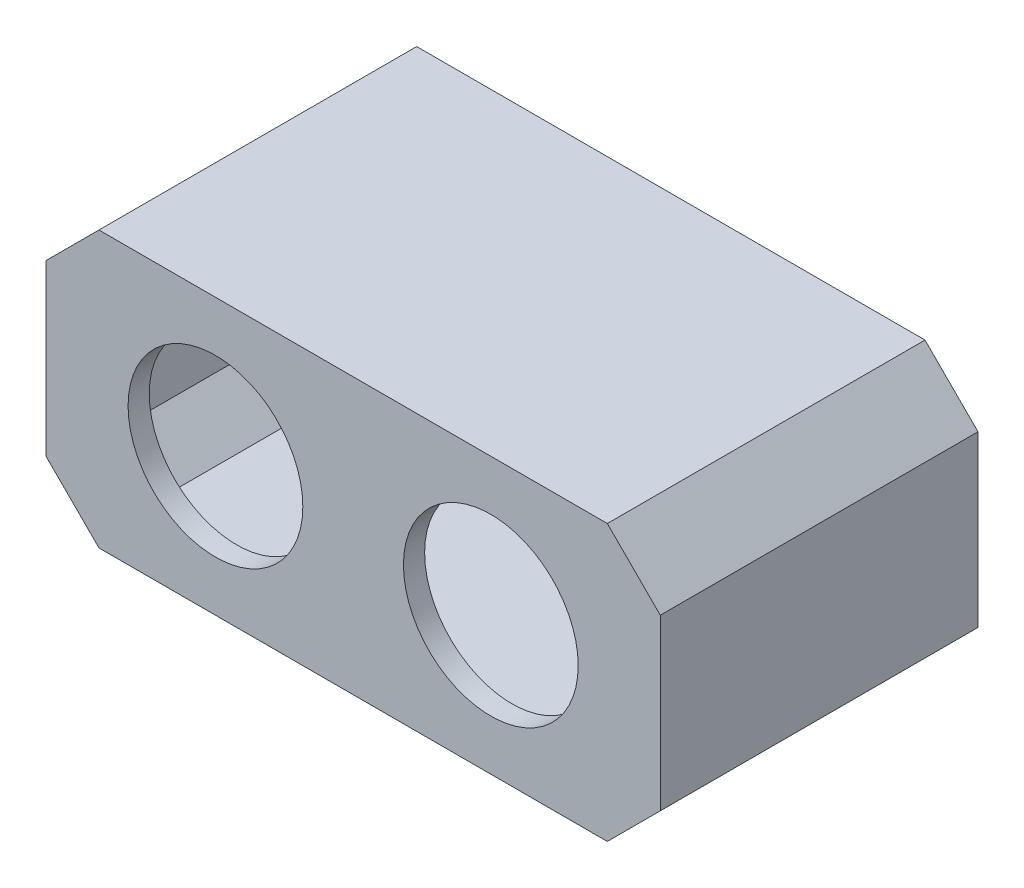
ISO-10303-21;
HEADER;
FILE_DESCRIPTION(('STEP AP214'),'2;1');
FILE_NAME('part.step','',(''),(''),'','','');
FILE_SCHEMA(('AUTOMOTIVE_DESIGN { 1 0 10303 214 1 1 1 1 }'));
ENDSEC;
DATA;
#1=APPLICATION_CONTEXT('core data for automotive mechanical design processes');
#2=APPLICATION_PROTOCOL_DEFINITION('international standard','automotive_design',2000,#1);
#3=PRODUCT_CONTEXT('',#1,'mechanical');
#4=PRODUCT('Part','Part','',(#3));
#5=PRODUCT_RELATED_PRODUCT_CATEGORY('part','',(#4));
#6=PRODUCT_DEFINITION_FORMATION('','',#4);
#7=PRODUCT_DEFINITION_CONTEXT('part definition',#1,'design');
#8=PRODUCT_DEFINITION('design','',#6,#7);
#9=PRODUCT_DEFINITION_SHAPE('','',#8);
#10=(LENGTH_UNIT() NAMED_UNIT(*) SI_UNIT(.MILLI.,.METRE.));
#11=(NAMED_UNIT(*) PLANE_ANGLE_UNIT() SI_UNIT($,.RADIAN.));
#12=(NAMED_UNIT(*) SI_UNIT($,.STERADIAN.) SOLID_ANGLE_UNIT());
#13=UNCERTAINTY_MEASURE_WITH_UNIT(LENGTH_MEASURE(1.E-05),#10,'distance_accuracy_value','');
#14=(GEOMETRIC_REPRESENTATION_CONTEXT(3) GLOBAL_UNCERTAINTY_ASSIGNED_CONTEXT((#13)) GLOBAL_UNIT_ASSIGNED_CONTEXT((#10,
#11,#12)) REPRESENTATION_CONTEXT('',''));
#15=CARTESIAN_POINT('',(0.,0.,0.));
#16=DIRECTION('',(0.,0.,1.));
#17=DIRECTION('',(1.,0.,0.));
#18=AXIS2_PLACEMENT_3D('',#15,#16,#17);
#19=CARTESIAN_POINT('',(0.,0.,-30.));
#20=DIRECTION('',(0.,0.,-1.));
#21=DIRECTION('',(-1.,0.,0.));
#22=AXIS2_PLACEMENT_3D('',#19,#20,#21);
#23=PLANE('',#22);
#24=DIRECTION('',(0.,1.,0.));
#25=VECTOR('',#24,1.);
#26=CARTESIAN_POINT('',(29.,-13.,-30.));
#27=LINE('',#26,#25);
#28=CARTESIAN_POINT('',(29.,-7.99999999999998,-30.));
#29=VERTEX_POINT('',#28);
#30=CARTESIAN_POINT('',(29.,7.99999999999999,-30.));
#31=VERTEX_POINT('',#30);
#32=EDGE_CURVE('E232',#29,#31,#27,.T.);
#33=ORIENTED_EDGE('',*,*,#32,.F.);
#34=DIRECTION('',(0.707106781186546,0.707106781186549,0.));
#35=VECTOR('',#34,1.);
#36=CARTESIAN_POINT('',(18.5000000000001,-18.5,-30.));
#37=LINE('',#36,#35);
#38=CARTESIAN_POINT('',(24.,-13.,-30.));
#39=VERTEX_POINT('',#38);
#40=EDGE_CURVE('E276',#29,#39,#37,.F.);
#41=ORIENTED_EDGE('',*,*,#40,.T.);
#42=DIRECTION('',(1.,0.,0.));
#43=VECTOR('',#42,1.);
#44=CARTESIAN_POINT('',(-29.,-13.,-30.));
#45=LINE('',#44,#43);
#46=CARTESIAN_POINT('',(-24.,-13.,-30.));
#47=VERTEX_POINT('',#46);
#48=EDGE_CURVE('E245',#47,#39,#45,.T.);
#49=ORIENTED_EDGE('',*,*,#48,.F.);
#50=DIRECTION('',(0.707106781186549,-0.707106781186546,0.));
#51=VECTOR('',#50,1.);
#52=CARTESIAN_POINT('',(-18.4999999999999,-18.5,-30.));
#53=LINE('',#52,#51);
#54=CARTESIAN_POINT('',(-29.,-8.,-30.));
#55=VERTEX_POINT('',#54);
#56=EDGE_CURVE('E280',#47,#55,#53,.F.);
#57=ORIENTED_EDGE('',*,*,#56,.T.);
#58=DIRECTION('',(0.,-1.,0.));
#59=VECTOR('',#58,1.);
#60=CARTESIAN_POINT('',(-29.,-13.,-30.));
#61=LINE('',#60,#59);
#62=CARTESIAN_POINT('',(-29.,7.99999999999997,-30.));
#63=VERTEX_POINT('',#62);
#64=EDGE_CURVE('E238',#63,#55,#61,.T.);
#65=ORIENTED_EDGE('',*,*,#64,.F.);
#66=DIRECTION('',(-0.707106781186546,-0.707106781186549,0.));
#67=VECTOR('',#66,1.);
#68=CARTESIAN_POINT('',(-18.5000000000001,18.5,-30.));
#69=LINE('',#68,#67);
#70=CARTESIAN_POINT('',(-24.,13.,-30.));
#71=VERTEX_POINT('',#70);
#72=EDGE_CURVE('E70',#63,#71,#69,.F.);
#73=ORIENTED_EDGE('',*,*,#72,.T.);
#74=DIRECTION('',(-1.,0.,0.));
#75=VECTOR('',#74,1.);
#76=CARTESIAN_POINT('',(-29.,13.,-30.));
#77=LINE('',#76,#75);
#78=CARTESIAN_POINT('',(24.,13.,-30.));
#79=VERTEX_POINT('',#78);
#80=EDGE_CURVE('E240',#79,#71,#77,.T.);
#81=ORIENTED_EDGE('',*,*,#80,.F.);
#82=DIRECTION('',(-0.707106781186549,0.707106781186546,0.));
#83=VECTOR('',#82,1.);
#84=CARTESIAN_POINT('',(18.4999999999999,18.5,-30.));
#85=LINE('',#84,#83);
#86=EDGE_CURVE('E273',#79,#31,#85,.F.);
#87=ORIENTED_EDGE('',*,*,#86,.T.);
#88=EDGE_LOOP('',(#33,#41,#49,#57,#65,#73,#81,#87));
#89=FACE_BOUND('',#88,.T.);
#90=DIRECTION('',(0.707106781186546,0.707106781186549,0.));
#91=VECTOR('',#90,1.);
#92=CARTESIAN_POINT('',(17.085786437627,-17.0857864376269,-30.));
#93=LINE('',#92,#91);
#94=CARTESIAN_POINT('',(27.,-7.17157287525379,-30.));
#95=VERTEX_POINT('',#94);
#96=CARTESIAN_POINT('',(23.1715728752538,-11.,-30.));
#97=VERTEX_POINT('',#96);
#98=EDGE_CURVE('E220',#95,#97,#93,.F.);
#99=ORIENTED_EDGE('',*,*,#98,.F.);
#100=DIRECTION('',(0.,1.,0.));
#101=VECTOR('',#100,1.);
#102=CARTESIAN_POINT('',(27.,-13.,-30.));
#103=LINE('',#102,#101);
#104=CARTESIAN_POINT('',(27.,7.1715728752538,-30.));
#105=VERTEX_POINT('',#104);
#106=EDGE_CURVE('E189',#95,#105,#103,.T.);
#107=ORIENTED_EDGE('',*,*,#106,.T.);
#108=DIRECTION('',(-0.707106781186549,0.707106781186546,0.));
#109=VECTOR('',#108,1.);
#110=CARTESIAN_POINT('',(17.0857864376268,17.0857864376269,-30.));
#111=LINE('',#110,#109);
#112=CARTESIAN_POINT('',(23.1715728752538,11.,-30.));
#113=VERTEX_POINT('',#112);
#114=EDGE_CURVE('E186',#113,#105,#111,.F.);
#115=ORIENTED_EDGE('',*,*,#114,.F.);
#116=DIRECTION('',(-1.,0.,0.));
#117=VECTOR('',#116,1.);
#118=CARTESIAN_POINT('',(-29.,11.,-30.));
#119=LINE('',#118,#117);
#120=CARTESIAN_POINT('',(-23.1715728752538,11.,-30.));
#121=VERTEX_POINT('',#120);
#122=EDGE_CURVE('E56',#113,#121,#119,.T.);
#123=ORIENTED_EDGE('',*,*,#122,.T.);
#124=DIRECTION('',(-0.707106781186546,-0.707106781186549,0.));
#125=VECTOR('',#124,1.);
#126=CARTESIAN_POINT('',(-17.085786437627,17.0857864376269,-30.));
#127=LINE('',#126,#125);
#128=CARTESIAN_POINT('',(-27.,7.17157287525379,-30.));
#129=VERTEX_POINT('',#128);
#130=EDGE_CURVE('E193',#129,#121,#127,.F.);
#131=ORIENTED_EDGE('',*,*,#130,.F.);
#132=DIRECTION('',(0.,-1.,0.));
#133=VECTOR('',#132,1.);
#134=CARTESIAN_POINT('',(-27.,-13.,-30.));
#135=LINE('',#134,#133);
#136=CARTESIAN_POINT('',(-27.,-7.1715728752538,-30.));
#137=VERTEX_POINT('',#136);
#138=EDGE_CURVE('E230',#129,#137,#135,.T.);
#139=ORIENTED_EDGE('',*,*,#138,.T.);
#140=DIRECTION('',(0.707106781186549,-0.707106781186546,0.));
#141=VECTOR('',#140,1.);
#142=CARTESIAN_POINT('',(-17.0857864376268,-17.0857864376269,-30.));
#143=LINE('',#142,#141);
#144=CARTESIAN_POINT('',(-23.1715728752538,-11.,-30.));
#145=VERTEX_POINT('',#144);
#146=EDGE_CURVE('E223',#145,#137,#143,.F.);
#147=ORIENTED_EDGE('',*,*,#146,.F.);
#148=DIRECTION('',(1.,0.,0.));
#149=VECTOR('',#148,1.);
#150=CARTESIAN_POINT('',(-29.,-11.,-30.));
#151=LINE('',#150,#149);
#152=EDGE_CURVE('E209',#145,#97,#151,.T.);
#153=ORIENTED_EDGE('',*,*,#152,.T.);
#154=EDGE_LOOP('',(#99,#107,#115,#123,#131,#139,#147,#153));
#155=FACE_BOUND('',#154,.T.);
#156=ADVANCED_FACE('F43',(#89,#155),#23,.T.);
#157=CARTESIAN_POINT('',(29.,-13.,-30.));
#158=DIRECTION('',(1.,0.,0.));
#159=DIRECTION('',(0.,0.,-1.));
#160=AXIS2_PLACEMENT_3D('',#157,#158,#159);
#161=PLANE('',#160);
#162=DIRECTION('',(0.,1.,0.));
#163=VECTOR('',#162,1.);
#164=CARTESIAN_POINT('',(29.,-13.,0.));
#165=LINE('',#164,#163);
#166=CARTESIAN_POINT('',(29.,-7.99999999999998,0.));
#167=VERTEX_POINT('',#166);
#168=CARTESIAN_POINT('',(29.,7.99999999999999,0.));
#169=VERTEX_POINT('',#168);
#170=EDGE_CURVE('E222',#167,#169,#165,.T.);
#171=ORIENTED_EDGE('',*,*,#170,.F.);
#172=DIRECTION('',(0.,0.,-1.));
#173=VECTOR('',#172,1.);
#174=CARTESIAN_POINT('',(29.,-7.99999999999998,-30.));
#175=LINE('',#174,#173);
#176=EDGE_CURVE('E275',#167,#29,#175,.T.);
#177=ORIENTED_EDGE('',*,*,#176,.T.);
#178=ORIENTED_EDGE('',*,*,#32,.T.);
#179=DIRECTION('',(0.,0.,1.));
#180=VECTOR('',#179,1.);
#181=CARTESIAN_POINT('',(29.,7.99999999999999,-30.));
#182=LINE('',#181,#180);
#183=EDGE_CURVE('E267',#31,#169,#182,.T.);
#184=ORIENTED_EDGE('',*,*,#183,.T.);
#185=EDGE_LOOP('',(#171,#177,#178,#184));
#186=FACE_BOUND('',#185,.T.);
#187=ADVANCED_FACE('F299',(#186),#161,.T.);
#188=CARTESIAN_POINT('',(-29.,-13.,-30.));
#189=DIRECTION('',(0.,-1.,0.));
#190=DIRECTION('',(0.,0.,-1.));
#191=AXIS2_PLACEMENT_3D('',#188,#189,#190);
#192=PLANE('',#191);
#193=CARTESIAN_POINT('',(0.,-13.,-15.));
#194=DIRECTION('',(0.,-1.,0.));
#195=DIRECTION('',(0.,0.,-1.));
#196=AXIS2_PLACEMENT_3D('',#193,#194,#195);
#197=CIRCLE('',#196,12.);
#198=CARTESIAN_POINT('',(0.,-13.,-27.));
#199=VERTEX_POINT('',#198);
#200=EDGE_CURVE('E512',#199,#199,#197,.T.);
#201=ORIENTED_EDGE('',*,*,#200,.F.);
#202=EDGE_LOOP('',(#201));
#203=FACE_BOUND('',#202,.T.);
#204=ORIENTED_EDGE('',*,*,#48,.T.);
#205=DIRECTION('',(0.,0.,1.));
#206=VECTOR('',#205,1.);
#207=CARTESIAN_POINT('',(24.,-13.,-30.));
#208=LINE('',#207,#206);
#209=CARTESIAN_POINT('',(24.,-13.,0.));
#210=VERTEX_POINT('',#209);
#211=EDGE_CURVE('E256',#39,#210,#208,.T.);
#212=ORIENTED_EDGE('',*,*,#211,.T.);
#213=DIRECTION('',(1.,0.,0.));
#214=VECTOR('',#213,1.);
#215=CARTESIAN_POINT('',(-29.,-13.,0.));
#216=LINE('',#215,#214);
#217=CARTESIAN_POINT('',(-24.,-13.,0.));
#218=VERTEX_POINT('',#217);
#219=EDGE_CURVE('E236',#218,#210,#216,.T.);
#220=ORIENTED_EDGE('',*,*,#219,.F.);
#221=DIRECTION('',(0.,0.,-1.));
#222=VECTOR('',#221,1.);
#223=CARTESIAN_POINT('',(-24.,-13.,-30.));
#224=LINE('',#223,#222);
#225=EDGE_CURVE('E248',#218,#47,#224,.T.);
#226=ORIENTED_EDGE('',*,*,#225,.T.);
#227=EDGE_LOOP('',(#204,#212,#220,#226));
#228=FACE_BOUND('',#227,.T.);
#229=ADVANCED_FACE('F307',(#203,#228),#192,.T.);
#230=CARTESIAN_POINT('',(-29.,-13.,-30.));
#231=DIRECTION('',(-1.,0.,0.));
#232=DIRECTION('',(0.,0.,1.));
#233=AXIS2_PLACEMENT_3D('',#230,#231,#232);
#234=PLANE('',#233);
#235=ORIENTED_EDGE('',*,*,#64,.T.);
#236=DIRECTION('',(0.,0.,1.));
#237=VECTOR('',#236,1.);
#238=CARTESIAN_POINT('',(-29.,-8.,-30.));
#239=LINE('',#238,#237);
#240=CARTESIAN_POINT('',(-29.,-8.,0.));
#241=VERTEX_POINT('',#240);
#242=EDGE_CURVE('E285',#55,#241,#239,.T.);
#243=ORIENTED_EDGE('',*,*,#242,.T.);
#244=DIRECTION('',(0.,-1.,0.));
#245=VECTOR('',#244,1.);
#246=CARTESIAN_POINT('',(-29.,-13.,0.));
#247=LINE('',#246,#245);
#248=CARTESIAN_POINT('',(-29.,7.99999999999997,0.));
#249=VERTEX_POINT('',#248);
#250=EDGE_CURVE('E252',#249,#241,#247,.T.);
#251=ORIENTED_EDGE('',*,*,#250,.F.);
#252=DIRECTION('',(0.,0.,-1.));
#253=VECTOR('',#252,1.);
#254=CARTESIAN_POINT('',(-29.,7.99999999999997,-30.));
#255=LINE('',#254,#253);
#256=EDGE_CURVE('E282',#249,#63,#255,.T.);
#257=ORIENTED_EDGE('',*,*,#256,.T.);
#258=EDGE_LOOP('',(#235,#243,#251,#257));
#259=FACE_BOUND('',#258,.T.);
#260=ADVANCED_FACE('F316',(#259),#234,.T.);
#261=CARTESIAN_POINT('',(-29.,13.,-30.));
#262=DIRECTION('',(0.,1.,0.));
#263=DIRECTION('',(0.,0.,1.));
#264=AXIS2_PLACEMENT_3D('',#261,#262,#263);
#265=PLANE('',#264);
#266=ORIENTED_EDGE('',*,*,#80,.T.);
#267=DIRECTION('',(0.,0.,1.));
#268=VECTOR('',#267,1.);
#269=CARTESIAN_POINT('',(-24.,13.,-30.));
#270=LINE('',#269,#268);
#271=CARTESIAN_POINT('',(-24.,13.,0.));
#272=VERTEX_POINT('',#271);
#273=EDGE_CURVE('E11',#71,#272,#270,.T.);
#274=ORIENTED_EDGE('',*,*,#273,.T.);
#275=DIRECTION('',(-1.,0.,0.));
#276=VECTOR('',#275,1.);
#277=CARTESIAN_POINT('',(-29.,13.,0.));
#278=LINE('',#277,#276);
#279=CARTESIAN_POINT('',(24.,13.,0.));
#280=VERTEX_POINT('',#279);
#281=EDGE_CURVE('E247',#280,#272,#278,.T.);
#282=ORIENTED_EDGE('',*,*,#281,.F.);
#283=DIRECTION('',(0.,0.,-1.));
#284=VECTOR('',#283,1.);
#285=CARTESIAN_POINT('',(24.,13.,-30.));
#286=LINE('',#285,#284);
#287=EDGE_CURVE('E55',#280,#79,#286,.T.);
#288=ORIENTED_EDGE('',*,*,#287,.T.);
#289=EDGE_LOOP('',(#266,#274,#282,#288));
#290=FACE_BOUND('',#289,.T.);
#291=ADVANCED_FACE('F286',(#290),#265,.T.);
#292=CARTESIAN_POINT('',(0.,0.,0.));
#293=DIRECTION('',(0.,0.,-1.));
#294=DIRECTION('',(-1.,0.,0.));
#295=AXIS2_PLACEMENT_3D('',#292,#293,#294);
#296=PLANE('',#295);
#297=CARTESIAN_POINT('',(-13.,0.,0.));
#298=DIRECTION('',(0.,0.,-1.));
#299=DIRECTION('',(-1.,0.,0.));
#300=AXIS2_PLACEMENT_3D('',#297,#298,#299);
#301=CIRCLE('',#300,8.25);
#302=CARTESIAN_POINT('',(-21.25,0.,0.));
#303=VERTEX_POINT('',#302);
#304=EDGE_CURVE('E509',#303,#303,#301,.T.);
#305=ORIENTED_EDGE('',*,*,#304,.T.);
#306=EDGE_LOOP('',(#305));
#307=FACE_BOUND('',#306,.T.);
#308=CARTESIAN_POINT('',(13.,0.,0.));
#309=DIRECTION('',(0.,0.,1.));
#310=DIRECTION('',(1.,0.,0.));
#311=AXIS2_PLACEMENT_3D('',#308,#309,#310);
#312=CIRCLE('',#311,8.25);
#313=CARTESIAN_POINT('',(21.25,0.,0.));
#314=VERTEX_POINT('',#313);
#315=EDGE_CURVE('E181',#314,#314,#312,.T.);
#316=ORIENTED_EDGE('',*,*,#315,.F.);
#317=EDGE_LOOP('',(#316));
#318=FACE_BOUND('',#317,.T.);
#319=ORIENTED_EDGE('',*,*,#219,.T.);
#320=DIRECTION('',(-0.707106781186546,-0.707106781186549,0.));
#321=VECTOR('',#320,1.);
#322=CARTESIAN_POINT('',(24.,-13.,0.));
#323=LINE('',#322,#321);
#324=EDGE_CURVE('E270',#210,#167,#323,.F.);
#325=ORIENTED_EDGE('',*,*,#324,.T.);
#326=ORIENTED_EDGE('',*,*,#170,.T.);
#327=DIRECTION('',(0.707106781186549,-0.707106781186546,0.));
#328=VECTOR('',#327,1.);
#329=CARTESIAN_POINT('',(29.,7.99999999999999,0.));
#330=LINE('',#329,#328);
#331=EDGE_CURVE('E261',#169,#280,#330,.F.);
#332=ORIENTED_EDGE('',*,*,#331,.T.);
#333=ORIENTED_EDGE('',*,*,#281,.T.);
#334=DIRECTION('',(0.707106781186546,0.707106781186549,0.));
#335=VECTOR('',#334,1.);
#336=CARTESIAN_POINT('',(-24.,13.,0.));
#337=LINE('',#336,#335);
#338=EDGE_CURVE('E263',#272,#249,#337,.F.);
#339=ORIENTED_EDGE('',*,*,#338,.T.);
#340=ORIENTED_EDGE('',*,*,#250,.T.);
#341=DIRECTION('',(-0.707106781186549,0.707106781186546,0.));
#342=VECTOR('',#341,1.);
#343=CARTESIAN_POINT('',(-29.,-8.,0.));
#344=LINE('',#343,#342);
#345=EDGE_CURVE('E264',#241,#218,#344,.F.);
#346=ORIENTED_EDGE('',*,*,#345,.T.);
#347=EDGE_LOOP('',(#319,#325,#326,#332,#333,#339,#340,#346));
#348=FACE_BOUND('',#347,.T.);
#349=ADVANCED_FACE('F298',(#307,#318,#348),#296,.F.);
#350=CARTESIAN_POINT('',(24.,-13.,-30.));
#351=DIRECTION('',(-0.707106781186549,0.707106781186546,0.));
#352=DIRECTION('',(0.,0.,1.));
#353=AXIS2_PLACEMENT_3D('',#350,#351,#352);
#354=PLANE('',#353);
#355=ORIENTED_EDGE('',*,*,#40,.F.);
#356=ORIENTED_EDGE('',*,*,#176,.F.);
#357=ORIENTED_EDGE('',*,*,#324,.F.);
#358=ORIENTED_EDGE('',*,*,#211,.F.);
#359=EDGE_LOOP('',(#355,#356,#357,#358));
#360=FACE_BOUND('',#359,.T.);
#361=ADVANCED_FACE('F304',(#360),#354,.F.);
#362=CARTESIAN_POINT('',(-29.,-8.,-30.));
#363=DIRECTION('',(0.707106781186546,0.707106781186549,0.));
#364=DIRECTION('',(0.,0.,1.));
#365=AXIS2_PLACEMENT_3D('',#362,#363,#364);
#366=PLANE('',#365);
#367=ORIENTED_EDGE('',*,*,#56,.F.);
#368=ORIENTED_EDGE('',*,*,#225,.F.);
#369=ORIENTED_EDGE('',*,*,#345,.F.);
#370=ORIENTED_EDGE('',*,*,#242,.F.);
#371=EDGE_LOOP('',(#367,#368,#369,#370));
#372=FACE_BOUND('',#371,.T.);
#373=ADVANCED_FACE('F311',(#372),#366,.F.);
#374=CARTESIAN_POINT('',(-24.,13.,-30.));
#375=DIRECTION('',(0.707106781186549,-0.707106781186546,0.));
#376=DIRECTION('',(0.,0.,1.));
#377=AXIS2_PLACEMENT_3D('',#374,#375,#376);
#378=PLANE('',#377);
#379=ORIENTED_EDGE('',*,*,#72,.F.);
#380=ORIENTED_EDGE('',*,*,#256,.F.);
#381=ORIENTED_EDGE('',*,*,#338,.F.);
#382=ORIENTED_EDGE('',*,*,#273,.F.);
#383=EDGE_LOOP('',(#379,#380,#381,#382));
#384=FACE_BOUND('',#383,.T.);
#385=ADVANCED_FACE('F317',(#384),#378,.F.);
#386=CARTESIAN_POINT('',(29.,7.99999999999999,-30.));
#387=DIRECTION('',(-0.707106781186546,-0.707106781186549,0.));
#388=DIRECTION('',(0.,0.,1.));
#389=AXIS2_PLACEMENT_3D('',#386,#387,#388);
#390=PLANE('',#389);
#391=ORIENTED_EDGE('',*,*,#86,.F.);
#392=ORIENTED_EDGE('',*,*,#287,.F.);
#393=ORIENTED_EDGE('',*,*,#331,.F.);
#394=ORIENTED_EDGE('',*,*,#183,.F.);
#395=EDGE_LOOP('',(#391,#392,#393,#394));
#396=FACE_BOUND('',#395,.T.);
#397=ADVANCED_FACE('F46',(#396),#390,.F.);
#398=CARTESIAN_POINT('',(27.,-13.,-30.));
#399=DIRECTION('',(1.,0.,0.));
#400=DIRECTION('',(0.,0.,-1.));
#401=AXIS2_PLACEMENT_3D('',#398,#399,#400);
#402=PLANE('',#401);
#403=DIRECTION('',(0.,1.,0.));
#404=VECTOR('',#403,1.);
#405=CARTESIAN_POINT('',(27.,-13.,-2.));
#406=LINE('',#405,#404);
#407=CARTESIAN_POINT('',(27.,-7.17157287525379,-2.));
#408=VERTEX_POINT('',#407);
#409=CARTESIAN_POINT('',(27.,7.1715728752538,-2.));
#410=VERTEX_POINT('',#409);
#411=EDGE_CURVE('E173',#408,#410,#406,.T.);
#412=ORIENTED_EDGE('',*,*,#411,.T.);
#413=DIRECTION('',(0.,0.,-1.));
#414=VECTOR('',#413,1.);
#415=CARTESIAN_POINT('',(27.,7.1715728752538,-30.));
#416=LINE('',#415,#414);
#417=EDGE_CURVE('E172',#105,#410,#416,.F.);
#418=ORIENTED_EDGE('',*,*,#417,.F.);
#419=ORIENTED_EDGE('',*,*,#106,.F.);
#420=DIRECTION('',(0.,0.,1.));
#421=VECTOR('',#420,1.);
#422=CARTESIAN_POINT('',(27.,-7.17157287525379,-30.));
#423=LINE('',#422,#421);
#424=EDGE_CURVE('E163',#408,#95,#423,.F.);
#425=ORIENTED_EDGE('',*,*,#424,.F.);
#426=EDGE_LOOP('',(#412,#418,#419,#425));
#427=FACE_BOUND('',#426,.T.);
#428=ADVANCED_FACE('F183',(#427),#402,.F.);
#429=CARTESIAN_POINT('',(-29.,-11.,-30.));
#430=DIRECTION('',(0.,-1.,0.));
#431=DIRECTION('',(0.,0.,-1.));
#432=AXIS2_PLACEMENT_3D('',#429,#430,#431);
#433=PLANE('',#432);
#434=ORIENTED_EDGE('',*,*,#152,.F.);
#435=DIRECTION('',(0.,0.,1.));
#436=VECTOR('',#435,1.);
#437=CARTESIAN_POINT('',(-23.1715728752538,-11.,-30.));
#438=LINE('',#437,#436);
#439=CARTESIAN_POINT('',(-23.1715728752538,-11.,-2.));
#440=VERTEX_POINT('',#439);
#441=EDGE_CURVE('E208',#440,#145,#438,.F.);
#442=ORIENTED_EDGE('',*,*,#441,.F.);
#443=DIRECTION('',(1.,0.,0.));
#444=VECTOR('',#443,1.);
#445=CARTESIAN_POINT('',(-29.,-11.,-2.));
#446=LINE('',#445,#444);
#447=CARTESIAN_POINT('',(23.1715728752538,-11.,-2.));
#448=VERTEX_POINT('',#447);
#449=EDGE_CURVE('E198',#440,#448,#446,.T.);
#450=ORIENTED_EDGE('',*,*,#449,.T.);
#451=DIRECTION('',(0.,0.,-1.));
#452=VECTOR('',#451,1.);
#453=CARTESIAN_POINT('',(23.1715728752538,-11.,-30.));
#454=LINE('',#453,#452);
#455=EDGE_CURVE('E170',#97,#448,#454,.F.);
#456=ORIENTED_EDGE('',*,*,#455,.F.);
#457=EDGE_LOOP('',(#434,#442,#450,#456));
#458=FACE_BOUND('',#457,.T.);
#459=ADVANCED_FACE('F394',(#458),#433,.F.);
#460=CARTESIAN_POINT('',(-27.,-13.,-30.));
#461=DIRECTION('',(-1.,0.,0.));
#462=DIRECTION('',(0.,0.,1.));
#463=AXIS2_PLACEMENT_3D('',#460,#461,#462);
#464=PLANE('',#463);
#465=ORIENTED_EDGE('',*,*,#138,.F.);
#466=DIRECTION('',(0.,0.,1.));
#467=VECTOR('',#466,1.);
#468=CARTESIAN_POINT('',(-27.,7.17157287525378,-30.));
#469=LINE('',#468,#467);
#470=CARTESIAN_POINT('',(-27.,7.17157287525379,-2.));
#471=VERTEX_POINT('',#470);
#472=EDGE_CURVE('E214',#471,#129,#469,.F.);
#473=ORIENTED_EDGE('',*,*,#472,.F.);
#474=DIRECTION('',(0.,-1.,0.));
#475=VECTOR('',#474,1.);
#476=CARTESIAN_POINT('',(-27.,-13.,-2.));
#477=LINE('',#476,#475);
#478=CARTESIAN_POINT('',(-27.,-7.1715728752538,-2.));
#479=VERTEX_POINT('',#478);
#480=EDGE_CURVE('E197',#471,#479,#477,.T.);
#481=ORIENTED_EDGE('',*,*,#480,.T.);
#482=DIRECTION('',(0.,0.,-1.));
#483=VECTOR('',#482,1.);
#484=CARTESIAN_POINT('',(-27.,-7.17157287525381,-30.));
#485=LINE('',#484,#483);
#486=EDGE_CURVE('E211',#137,#479,#485,.F.);
#487=ORIENTED_EDGE('',*,*,#486,.F.);
#488=EDGE_LOOP('',(#465,#473,#481,#487));
#489=FACE_BOUND('',#488,.T.);
#490=ADVANCED_FACE('F402',(#489),#464,.F.);
#491=CARTESIAN_POINT('',(-29.,11.,-30.));
#492=DIRECTION('',(0.,1.,0.));
#493=DIRECTION('',(0.,0.,1.));
#494=AXIS2_PLACEMENT_3D('',#491,#492,#493);
#495=PLANE('',#494);
#496=ORIENTED_EDGE('',*,*,#122,.F.);
#497=DIRECTION('',(0.,0.,1.));
#498=VECTOR('',#497,1.);
#499=CARTESIAN_POINT('',(23.1715728752538,11.,-30.));
#500=LINE('',#499,#498);
#501=CARTESIAN_POINT('',(23.1715728752538,11.,-2.));
#502=VERTEX_POINT('',#501);
#503=EDGE_CURVE('E212',#502,#113,#500,.F.);
#504=ORIENTED_EDGE('',*,*,#503,.F.);
#505=DIRECTION('',(-1.,0.,0.));
#506=VECTOR('',#505,1.);
#507=CARTESIAN_POINT('',(-29.,11.,-2.));
#508=LINE('',#507,#506);
#509=CARTESIAN_POINT('',(-23.1715728752538,11.,-2.));
#510=VERTEX_POINT('',#509);
#511=EDGE_CURVE('E185',#502,#510,#508,.T.);
#512=ORIENTED_EDGE('',*,*,#511,.T.);
#513=DIRECTION('',(0.,0.,-1.));
#514=VECTOR('',#513,1.);
#515=CARTESIAN_POINT('',(-23.1715728752538,11.,-30.));
#516=LINE('',#515,#514);
#517=EDGE_CURVE('E217',#121,#510,#516,.F.);
#518=ORIENTED_EDGE('',*,*,#517,.F.);
#519=EDGE_LOOP('',(#496,#504,#512,#518));
#520=FACE_BOUND('',#519,.T.);
#521=ADVANCED_FACE('F413',(#520),#495,.F.);
#522=CARTESIAN_POINT('',(0.,0.,-2.));
#523=DIRECTION('',(0.,0.,-1.));
#524=DIRECTION('',(-1.,0.,0.));
#525=AXIS2_PLACEMENT_3D('',#522,#523,#524);
#526=PLANE('',#525);
#527=CARTESIAN_POINT('',(-13.,0.,-2.));
#528=DIRECTION('',(0.,0.,-1.));
#529=DIRECTION('',(-1.,0.,0.));
#530=AXIS2_PLACEMENT_3D('',#527,#528,#529);
#531=CIRCLE('',#530,8.25);
#532=CARTESIAN_POINT('',(-21.25,0.,-2.));
#533=VERTEX_POINT('',#532);
#534=EDGE_CURVE('E514',#533,#533,#531,.T.);
#535=ORIENTED_EDGE('',*,*,#534,.F.);
#536=EDGE_LOOP('',(#535));
#537=FACE_BOUND('',#536,.T.);
#538=CARTESIAN_POINT('',(13.,0.,-2.));
#539=DIRECTION('',(0.,0.,-1.));
#540=DIRECTION('',(-1.,0.,0.));
#541=AXIS2_PLACEMENT_3D('',#538,#539,#540);
#542=CIRCLE('',#541,8.25);
#543=CARTESIAN_POINT('',(4.75,0.,-2.));
#544=VERTEX_POINT('',#543);
#545=EDGE_CURVE('E523',#544,#544,#542,.F.);
#546=ORIENTED_EDGE('',*,*,#545,.T.);
#547=EDGE_LOOP('',(#546));
#548=FACE_BOUND('',#547,.T.);
#549=ORIENTED_EDGE('',*,*,#449,.F.);
#550=DIRECTION('',(-0.707106781186549,0.707106781186546,0.));
#551=VECTOR('',#550,1.);
#552=CARTESIAN_POINT('',(-27.5857864376269,-6.5857864376269,-2.));
#553=LINE('',#552,#551);
#554=EDGE_CURVE('E174',#479,#440,#553,.F.);
#555=ORIENTED_EDGE('',*,*,#554,.F.);
#556=ORIENTED_EDGE('',*,*,#480,.F.);
#557=DIRECTION('',(0.707106781186546,0.707106781186549,0.));
#558=VECTOR('',#557,1.);
#559=CARTESIAN_POINT('',(-22.5857864376269,11.5857864376269,-2.));
#560=LINE('',#559,#558);
#561=EDGE_CURVE('E199',#510,#471,#560,.F.);
#562=ORIENTED_EDGE('',*,*,#561,.F.);
#563=ORIENTED_EDGE('',*,*,#511,.F.);
#564=DIRECTION('',(0.707106781186549,-0.707106781186546,0.));
#565=VECTOR('',#564,1.);
#566=CARTESIAN_POINT('',(27.5857864376269,6.5857864376269,-2.));
#567=LINE('',#566,#565);
#568=EDGE_CURVE('E176',#410,#502,#567,.F.);
#569=ORIENTED_EDGE('',*,*,#568,.F.);
#570=ORIENTED_EDGE('',*,*,#411,.F.);
#571=DIRECTION('',(-0.707106781186546,-0.707106781186549,0.));
#572=VECTOR('',#571,1.);
#573=CARTESIAN_POINT('',(22.5857864376269,-11.5857864376269,-2.));
#574=LINE('',#573,#572);
#575=EDGE_CURVE('E159',#448,#408,#574,.F.);
#576=ORIENTED_EDGE('',*,*,#575,.F.);
#577=EDGE_LOOP('',(#549,#555,#556,#562,#563,#569,#570,#576));
#578=FACE_BOUND('',#577,.T.);
#579=ADVANCED_FACE('F178',(#537,#548,#578),#526,.T.);
#580=CARTESIAN_POINT('',(22.5857864376269,-11.5857864376269,-30.));
#581=DIRECTION('',(-0.707106781186549,0.707106781186546,0.));
#582=DIRECTION('',(0.,0.,1.));
#583=AXIS2_PLACEMENT_3D('',#580,#581,#582);
#584=PLANE('',#583);
#585=ORIENTED_EDGE('',*,*,#98,.T.);
#586=ORIENTED_EDGE('',*,*,#455,.T.);
#587=ORIENTED_EDGE('',*,*,#575,.T.);
#588=ORIENTED_EDGE('',*,*,#424,.T.);
#589=EDGE_LOOP('',(#585,#586,#587,#588));
#590=FACE_BOUND('',#589,.T.);
#591=ADVANCED_FACE('F165',(#590),#584,.T.);
#592=CARTESIAN_POINT('',(-27.5857864376269,-6.5857864376269,-30.));
#593=DIRECTION('',(0.707106781186546,0.707106781186549,0.));
#594=DIRECTION('',(0.,0.,1.));
#595=AXIS2_PLACEMENT_3D('',#592,#593,#594);
#596=PLANE('',#595);
#597=ORIENTED_EDGE('',*,*,#146,.T.);
#598=ORIENTED_EDGE('',*,*,#486,.T.);
#599=ORIENTED_EDGE('',*,*,#554,.T.);
#600=ORIENTED_EDGE('',*,*,#441,.T.);
#601=EDGE_LOOP('',(#597,#598,#599,#600));
#602=FACE_BOUND('',#601,.T.);
#603=ADVANCED_FACE('F438',(#602),#596,.T.);
#604=CARTESIAN_POINT('',(-22.5857864376269,11.5857864376269,-30.));
#605=DIRECTION('',(0.707106781186549,-0.707106781186546,0.));
#606=DIRECTION('',(0.,0.,1.));
#607=AXIS2_PLACEMENT_3D('',#604,#605,#606);
#608=PLANE('',#607);
#609=ORIENTED_EDGE('',*,*,#130,.T.);
#610=ORIENTED_EDGE('',*,*,#517,.T.);
#611=ORIENTED_EDGE('',*,*,#561,.T.);
#612=ORIENTED_EDGE('',*,*,#472,.T.);
#613=EDGE_LOOP('',(#609,#610,#611,#612));
#614=FACE_BOUND('',#613,.T.);
#615=ADVANCED_FACE('F450',(#614),#608,.T.);
#616=CARTESIAN_POINT('',(27.5857864376269,6.5857864376269,-30.));
#617=DIRECTION('',(-0.707106781186546,-0.707106781186549,0.));
#618=DIRECTION('',(0.,0.,1.));
#619=AXIS2_PLACEMENT_3D('',#616,#617,#618);
#620=PLANE('',#619);
#621=ORIENTED_EDGE('',*,*,#114,.T.);
#622=ORIENTED_EDGE('',*,*,#417,.T.);
#623=ORIENTED_EDGE('',*,*,#568,.T.);
#624=ORIENTED_EDGE('',*,*,#503,.T.);
#625=EDGE_LOOP('',(#621,#622,#623,#624));
#626=FACE_BOUND('',#625,.T.);
#627=ADVANCED_FACE('F337',(#626),#620,.T.);
#628=CARTESIAN_POINT('',(13.,0.,-30.001));
#629=DIRECTION('',(0.,0.,1.));
#630=DIRECTION('',(1.,0.,0.));
#631=AXIS2_PLACEMENT_3D('',#628,#629,#630);
#632=CYLINDRICAL_SURFACE('',#631,8.25);
#633=ORIENTED_EDGE('',*,*,#545,.F.);
#634=EDGE_LOOP('',(#633));
#635=FACE_BOUND('',#634,.T.);
#636=ORIENTED_EDGE('',*,*,#315,.T.);
#637=EDGE_LOOP('',(#636));
#638=FACE_BOUND('',#637,.T.);
#639=ADVANCED_FACE('F468',(#635,#638),#632,.F.);
#640=CARTESIAN_POINT('',(-13.,0.,-30.001));
#641=DIRECTION('',(0.,0.,1.));
#642=DIRECTION('',(1.,0.,0.));
#643=AXIS2_PLACEMENT_3D('',#640,#641,#642);
#644=CYLINDRICAL_SURFACE('',#643,8.25);
#645=ORIENTED_EDGE('',*,*,#534,.T.);
#646=EDGE_LOOP('',(#645));
#647=FACE_BOUND('',#646,.T.);
#648=ORIENTED_EDGE('',*,*,#304,.F.);
#649=EDGE_LOOP('',(#648));
#650=FACE_BOUND('',#649,.T.);
#651=ADVANCED_FACE('F474',(#647,#650),#644,.F.);
#652=CARTESIAN_POINT('',(0.,-12.,-15.));
#653=DIRECTION('',(0.,-1.,0.));
#654=DIRECTION('',(0.,0.,-1.));
#655=AXIS2_PLACEMENT_3D('',#652,#653,#654);
#656=CYLINDRICAL_SURFACE('',#655,12.);
#657=CARTESIAN_POINT('',(0.,-12.,-15.));
#658=DIRECTION('',(0.,-1.,0.));
#659=DIRECTION('',(0.,0.,-1.));
#660=AXIS2_PLACEMENT_3D('',#657,#658,#659);
#661=CIRCLE('',#660,12.);
#662=CARTESIAN_POINT('',(0.,-12.,-27.));
#663=VERTEX_POINT('',#662);
#664=EDGE_CURVE('E507',#663,#663,#661,.T.);
#665=ORIENTED_EDGE('',*,*,#664,.F.);
#666=EDGE_LOOP('',(#665));
#667=FACE_BOUND('',#666,.T.);
#668=ORIENTED_EDGE('',*,*,#200,.T.);
#669=EDGE_LOOP('',(#668));
#670=FACE_BOUND('',#669,.T.);
#671=ADVANCED_FACE('F482',(#667,#670),#656,.F.);
#672=CARTESIAN_POINT('',(0.,-12.,-15.));
#673=DIRECTION('',(0.,-1.,0.));
#674=DIRECTION('',(0.,0.,-1.));
#675=AXIS2_PLACEMENT_3D('',#672,#673,#674);
#676=PLANE('',#675);
#677=ORIENTED_EDGE('',*,*,#664,.T.);
#678=EDGE_LOOP('',(#677));
#679=FACE_BOUND('',#678,.T.);
#680=ADVANCED_FACE('F493',(#679),#676,.T.);
#681=CLOSED_SHELL('',(#156,#187,#229,#260,#291,#349,#361,#373,#385,#397,#428,#459,#490,#521,
#579,#591,#603,#615,#627,#639,#651,#671,#680));
#682=MANIFOLD_SOLID_BREP('B2',#681);
#683=ADVANCED_BREP_SHAPE_REPRESENTATION('',(#18,#682),#14);
#684=SHAPE_DEFINITION_REPRESENTATION(#9,#683);
ENDSEC;
END-ISO-10303-21;
